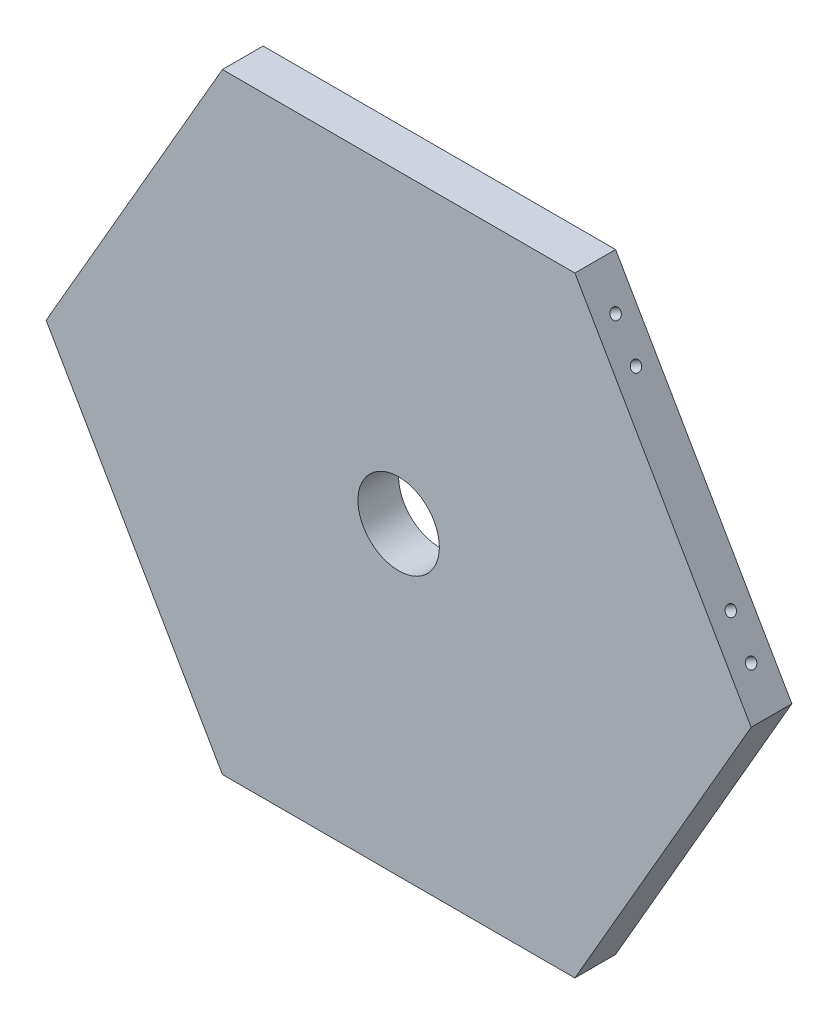
ISO-10303-21;
HEADER;
FILE_DESCRIPTION(('STEP AP214'),'2;1');
FILE_NAME('part.step','',(''),(''),'','','');
FILE_SCHEMA(('AUTOMOTIVE_DESIGN { 1 0 10303 214 1 1 1 1 }'));
ENDSEC;
DATA;
#1=APPLICATION_CONTEXT('core data for automotive mechanical design processes');
#2=APPLICATION_PROTOCOL_DEFINITION('international standard','automotive_design',2000,#1);
#3=PRODUCT_CONTEXT('',#1,'mechanical');
#4=PRODUCT('Part','Part','',(#3));
#5=PRODUCT_RELATED_PRODUCT_CATEGORY('part','',(#4));
#6=PRODUCT_DEFINITION_FORMATION('','',#4);
#7=PRODUCT_DEFINITION_CONTEXT('part definition',#1,'design');
#8=PRODUCT_DEFINITION('design','',#6,#7);
#9=PRODUCT_DEFINITION_SHAPE('','',#8);
#10=(LENGTH_UNIT() NAMED_UNIT(*) SI_UNIT(.MILLI.,.METRE.));
#11=(NAMED_UNIT(*) PLANE_ANGLE_UNIT() SI_UNIT($,.RADIAN.));
#12=(NAMED_UNIT(*) SI_UNIT($,.STERADIAN.) SOLID_ANGLE_UNIT());
#13=UNCERTAINTY_MEASURE_WITH_UNIT(LENGTH_MEASURE(1.E-05),#10,'distance_accuracy_value','');
#14=(GEOMETRIC_REPRESENTATION_CONTEXT(3) GLOBAL_UNCERTAINTY_ASSIGNED_CONTEXT((#13)) GLOBAL_UNIT_ASSIGNED_CONTEXT((#10,
#11,#12)) REPRESENTATION_CONTEXT('',''));
#15=CARTESIAN_POINT('',(0.,0.,0.));
#16=DIRECTION('',(0.,0.,1.));
#17=DIRECTION('',(1.,0.,0.));
#18=AXIS2_PLACEMENT_3D('',#15,#16,#17);
#19=CARTESIAN_POINT('',(-86.6025403784438,0.,5.));
#20=DIRECTION('',(0.866025403784439,0.5,0.));
#21=DIRECTION('',(-0.5,0.866025403784439,0.));
#22=AXIS2_PLACEMENT_3D('',#19,#20,#21);
#23=PLANE('',#22);
#24=DIRECTION('',(0.5,-0.866025403784439,0.));
#25=VECTOR('',#24,1.);
#26=CARTESIAN_POINT('',(-86.6025403784438,0.,-5.));
#27=LINE('',#26,#25);
#28=CARTESIAN_POINT('',(-86.6025403784438,0.,-5.));
#29=VERTEX_POINT('',#28);
#30=CARTESIAN_POINT('',(-43.3012701892219,-75.,-5.));
#31=VERTEX_POINT('',#30);
#32=EDGE_CURVE('E135',#29,#31,#27,.T.);
#33=ORIENTED_EDGE('',*,*,#32,.T.);
#34=DIRECTION('',(0.,0.,-1.));
#35=VECTOR('',#34,1.);
#36=CARTESIAN_POINT('',(-43.3012701892219,-75.,5.));
#37=LINE('',#36,#35);
#38=CARTESIAN_POINT('',(-43.3012701892219,-75.,5.));
#39=VERTEX_POINT('',#38);
#40=EDGE_CURVE('E11',#39,#31,#37,.T.);
#41=ORIENTED_EDGE('',*,*,#40,.F.);
#42=DIRECTION('',(0.5,-0.866025403784439,0.));
#43=VECTOR('',#42,1.);
#44=CARTESIAN_POINT('',(-86.6025403784438,0.,5.));
#45=LINE('',#44,#43);
#46=CARTESIAN_POINT('',(-86.6025403784438,0.,5.));
#47=VERTEX_POINT('',#46);
#48=EDGE_CURVE('E152',#47,#39,#45,.T.);
#49=ORIENTED_EDGE('',*,*,#48,.F.);
#50=DIRECTION('',(0.,0.,-1.));
#51=VECTOR('',#50,1.);
#52=CARTESIAN_POINT('',(-86.6025403784438,0.,5.));
#53=LINE('',#52,#51);
#54=EDGE_CURVE('E131',#47,#29,#53,.T.);
#55=ORIENTED_EDGE('',*,*,#54,.T.);
#56=EDGE_LOOP('',(#33,#41,#49,#55));
#57=FACE_BOUND('',#56,.T.);
#58=ADVANCED_FACE('F44',(#57),#23,.F.);
#59=CARTESIAN_POINT('',(-43.3012701892219,-75.,5.));
#60=DIRECTION('',(0.,1.,0.));
#61=DIRECTION('',(0.,0.,1.));
#62=AXIS2_PLACEMENT_3D('',#59,#60,#61);
#63=PLANE('',#62);
#64=CARTESIAN_POINT('',(-33.3012701892219,-75.,0.));
#65=DIRECTION('',(0.,-1.,0.));
#66=DIRECTION('',(0.,0.,-1.));
#67=AXIS2_PLACEMENT_3D('',#64,#65,#66);
#68=CIRCLE('',#67,1.25);
#69=CARTESIAN_POINT('',(-33.3012701892219,-75.,-1.25));
#70=VERTEX_POINT('',#69);
#71=EDGE_CURVE('E276',#70,#70,#68,.T.);
#72=ORIENTED_EDGE('',*,*,#71,.F.);
#73=EDGE_LOOP('',(#72));
#74=FACE_BOUND('',#73,.T.);
#75=CARTESIAN_POINT('',(-23.3012701892219,-75.,0.));
#76=DIRECTION('',(0.,-1.,0.));
#77=DIRECTION('',(0.,0.,-1.));
#78=AXIS2_PLACEMENT_3D('',#75,#76,#77);
#79=CIRCLE('',#78,1.25);
#80=CARTESIAN_POINT('',(-23.3012701892219,-75.,-1.25));
#81=VERTEX_POINT('',#80);
#82=EDGE_CURVE('E280',#81,#81,#79,.T.);
#83=ORIENTED_EDGE('',*,*,#82,.F.);
#84=EDGE_LOOP('',(#83));
#85=FACE_BOUND('',#84,.T.);
#86=CARTESIAN_POINT('',(23.3012701892219,-75.,0.));
#87=DIRECTION('',(0.,-1.,0.));
#88=DIRECTION('',(0.,0.,1.));
#89=AXIS2_PLACEMENT_3D('',#86,#87,#88);
#90=CIRCLE('',#89,1.25);
#91=CARTESIAN_POINT('',(23.3012701892219,-75.,1.25));
#92=VERTEX_POINT('',#91);
#93=EDGE_CURVE('E287',#92,#92,#90,.T.);
#94=ORIENTED_EDGE('',*,*,#93,.F.);
#95=EDGE_LOOP('',(#94));
#96=FACE_BOUND('',#95,.T.);
#97=CARTESIAN_POINT('',(33.3012701892219,-75.,0.));
#98=DIRECTION('',(0.,-1.,0.));
#99=DIRECTION('',(0.,0.,1.));
#100=AXIS2_PLACEMENT_3D('',#97,#98,#99);
#101=CIRCLE('',#100,1.25);
#102=CARTESIAN_POINT('',(33.3012701892219,-75.,1.25));
#103=VERTEX_POINT('',#102);
#104=EDGE_CURVE('E295',#103,#103,#101,.T.);
#105=ORIENTED_EDGE('',*,*,#104,.F.);
#106=EDGE_LOOP('',(#105));
#107=FACE_BOUND('',#106,.T.);
#108=DIRECTION('',(1.,0.,0.));
#109=VECTOR('',#108,1.);
#110=CARTESIAN_POINT('',(-43.3012701892219,-75.,-5.));
#111=LINE('',#110,#109);
#112=CARTESIAN_POINT('',(43.3012701892219,-75.,-5.));
#113=VERTEX_POINT('',#112);
#114=EDGE_CURVE('E139',#31,#113,#111,.T.);
#115=ORIENTED_EDGE('',*,*,#114,.T.);
#116=DIRECTION('',(0.,0.,-1.));
#117=VECTOR('',#116,1.);
#118=CARTESIAN_POINT('',(43.3012701892219,-75.,5.));
#119=LINE('',#118,#117);
#120=CARTESIAN_POINT('',(43.3012701892219,-75.,5.));
#121=VERTEX_POINT('',#120);
#122=EDGE_CURVE('E53',#121,#113,#119,.T.);
#123=ORIENTED_EDGE('',*,*,#122,.F.);
#124=DIRECTION('',(1.,0.,0.));
#125=VECTOR('',#124,1.);
#126=CARTESIAN_POINT('',(-43.3012701892219,-75.,5.));
#127=LINE('',#126,#125);
#128=EDGE_CURVE('E98',#39,#121,#127,.T.);
#129=ORIENTED_EDGE('',*,*,#128,.F.);
#130=ORIENTED_EDGE('',*,*,#40,.T.);
#131=EDGE_LOOP('',(#115,#123,#129,#130));
#132=FACE_BOUND('',#131,.T.);
#133=ADVANCED_FACE('F185',(#74,#85,#96,#107,#132),#63,.F.);
#134=CARTESIAN_POINT('',(43.3012701892219,-75.,5.));
#135=DIRECTION('',(-0.866025403784439,0.5,0.));
#136=DIRECTION('',(-0.5,-0.866025403784439,0.));
#137=AXIS2_PLACEMENT_3D('',#134,#135,#136);
#138=PLANE('',#137);
#139=DIRECTION('',(0.5,0.866025403784439,0.));
#140=VECTOR('',#139,1.);
#141=CARTESIAN_POINT('',(43.3012701892219,-75.,-5.));
#142=LINE('',#141,#140);
#143=CARTESIAN_POINT('',(86.6025403784438,0.,-5.));
#144=VERTEX_POINT('',#143);
#145=EDGE_CURVE('E143',#113,#144,#142,.T.);
#146=ORIENTED_EDGE('',*,*,#145,.T.);
#147=DIRECTION('',(0.,0.,-1.));
#148=VECTOR('',#147,1.);
#149=CARTESIAN_POINT('',(86.6025403784438,0.,5.));
#150=LINE('',#149,#148);
#151=CARTESIAN_POINT('',(86.6025403784438,0.,5.));
#152=VERTEX_POINT('',#151);
#153=EDGE_CURVE('E122',#152,#144,#150,.T.);
#154=ORIENTED_EDGE('',*,*,#153,.F.);
#155=DIRECTION('',(0.5,0.866025403784439,0.));
#156=VECTOR('',#155,1.);
#157=CARTESIAN_POINT('',(43.3012701892219,-75.,5.));
#158=LINE('',#157,#156);
#159=EDGE_CURVE('E111',#121,#152,#158,.T.);
#160=ORIENTED_EDGE('',*,*,#159,.F.);
#161=ORIENTED_EDGE('',*,*,#122,.T.);
#162=EDGE_LOOP('',(#146,#154,#160,#161));
#163=FACE_BOUND('',#162,.T.);
#164=ADVANCED_FACE('F163',(#163),#138,.F.);
#165=CARTESIAN_POINT('',(86.6025403784438,0.,5.));
#166=DIRECTION('',(-0.866025403784439,-0.5,0.));
#167=DIRECTION('',(0.5,-0.866025403784439,0.));
#168=AXIS2_PLACEMENT_3D('',#165,#166,#167);
#169=PLANE('',#168);
#170=CARTESIAN_POINT('',(81.6025403784439,8.66025403784365,0.));
#171=DIRECTION('',(0.866025403784443,0.499999999999992,0.));
#172=DIRECTION('',(0.,0.,-1.));
#173=AXIS2_PLACEMENT_3D('',#170,#171,#172);
#174=CIRCLE('',#173,1.25);
#175=CARTESIAN_POINT('',(81.6025403784439,8.66025403784365,-1.25));
#176=VERTEX_POINT('',#175);
#177=EDGE_CURVE('E204',#176,#176,#174,.T.);
#178=ORIENTED_EDGE('',*,*,#177,.F.);
#179=EDGE_LOOP('',(#178));
#180=FACE_BOUND('',#179,.T.);
#181=CARTESIAN_POINT('',(76.602540378444,17.3205080756881,0.));
#182=DIRECTION('',(0.866025403784443,0.499999999999992,0.));
#183=DIRECTION('',(0.,0.,-1.));
#184=AXIS2_PLACEMENT_3D('',#181,#182,#183);
#185=CIRCLE('',#184,1.25);
#186=CARTESIAN_POINT('',(76.602540378444,17.3205080756881,-1.25));
#187=VERTEX_POINT('',#186);
#188=EDGE_CURVE('E208',#187,#187,#185,.T.);
#189=ORIENTED_EDGE('',*,*,#188,.F.);
#190=EDGE_LOOP('',(#189));
#191=FACE_BOUND('',#190,.T.);
#192=CARTESIAN_POINT('',(53.3012701892225,57.6794919243107,0.));
#193=DIRECTION('',(0.866025403784443,0.499999999999992,0.));
#194=DIRECTION('',(0.,0.,1.));
#195=AXIS2_PLACEMENT_3D('',#192,#193,#194);
#196=CIRCLE('',#195,1.25);
#197=CARTESIAN_POINT('',(53.3012701892225,57.6794919243107,1.25));
#198=VERTEX_POINT('',#197);
#199=EDGE_CURVE('E212',#198,#198,#196,.T.);
#200=ORIENTED_EDGE('',*,*,#199,.F.);
#201=EDGE_LOOP('',(#200));
#202=FACE_BOUND('',#201,.T.);
#203=CARTESIAN_POINT('',(48.3012701892225,66.3397459621551,0.));
#204=DIRECTION('',(0.866025403784443,0.499999999999992,0.));
#205=DIRECTION('',(0.,0.,1.));
#206=AXIS2_PLACEMENT_3D('',#203,#204,#205);
#207=CIRCLE('',#206,1.25);
#208=CARTESIAN_POINT('',(48.3012701892225,66.3397459621551,1.25));
#209=VERTEX_POINT('',#208);
#210=EDGE_CURVE('E215',#209,#209,#207,.T.);
#211=ORIENTED_EDGE('',*,*,#210,.F.);
#212=EDGE_LOOP('',(#211));
#213=FACE_BOUND('',#212,.T.);
#214=DIRECTION('',(-0.5,0.866025403784439,0.));
#215=VECTOR('',#214,1.);
#216=CARTESIAN_POINT('',(86.6025403784438,0.,-5.));
#217=LINE('',#216,#215);
#218=CARTESIAN_POINT('',(43.3012701892219,75.,-5.));
#219=VERTEX_POINT('',#218);
#220=EDGE_CURVE('E120',#144,#219,#217,.T.);
#221=ORIENTED_EDGE('',*,*,#220,.T.);
#222=DIRECTION('',(0.,0.,-1.));
#223=VECTOR('',#222,1.);
#224=CARTESIAN_POINT('',(43.3012701892219,75.,5.));
#225=LINE('',#224,#223);
#226=CARTESIAN_POINT('',(43.3012701892219,75.,5.));
#227=VERTEX_POINT('',#226);
#228=EDGE_CURVE('E117',#227,#219,#225,.T.);
#229=ORIENTED_EDGE('',*,*,#228,.F.);
#230=DIRECTION('',(-0.5,0.866025403784439,0.));
#231=VECTOR('',#230,1.);
#232=CARTESIAN_POINT('',(86.6025403784438,0.,5.));
#233=LINE('',#232,#231);
#234=EDGE_CURVE('E105',#152,#227,#233,.T.);
#235=ORIENTED_EDGE('',*,*,#234,.F.);
#236=ORIENTED_EDGE('',*,*,#153,.T.);
#237=EDGE_LOOP('',(#221,#229,#235,#236));
#238=FACE_BOUND('',#237,.T.);
#239=ADVANCED_FACE('F118',(#180,#191,#202,#213,#238),#169,.F.);
#240=CARTESIAN_POINT('',(43.3012701892219,75.,5.));
#241=DIRECTION('',(0.,-1.,0.));
#242=DIRECTION('',(0.,0.,-1.));
#243=AXIS2_PLACEMENT_3D('',#240,#241,#242);
#244=PLANE('',#243);
#245=DIRECTION('',(-1.,0.,0.));
#246=VECTOR('',#245,1.);
#247=CARTESIAN_POINT('',(43.3012701892219,75.,-5.));
#248=LINE('',#247,#246);
#249=CARTESIAN_POINT('',(-43.3012701892219,75.,-5.));
#250=VERTEX_POINT('',#249);
#251=EDGE_CURVE('E84',#219,#250,#248,.T.);
#252=ORIENTED_EDGE('',*,*,#251,.T.);
#253=DIRECTION('',(0.,0.,-1.));
#254=VECTOR('',#253,1.);
#255=CARTESIAN_POINT('',(-43.3012701892219,75.,5.));
#256=LINE('',#255,#254);
#257=CARTESIAN_POINT('',(-43.3012701892219,75.,5.));
#258=VERTEX_POINT('',#257);
#259=EDGE_CURVE('E123',#258,#250,#256,.T.);
#260=ORIENTED_EDGE('',*,*,#259,.F.);
#261=DIRECTION('',(-1.,0.,0.));
#262=VECTOR('',#261,1.);
#263=CARTESIAN_POINT('',(43.3012701892219,75.,5.));
#264=LINE('',#263,#262);
#265=EDGE_CURVE('E109',#227,#258,#264,.T.);
#266=ORIENTED_EDGE('',*,*,#265,.F.);
#267=ORIENTED_EDGE('',*,*,#228,.T.);
#268=EDGE_LOOP('',(#252,#260,#266,#267));
#269=FACE_BOUND('',#268,.T.);
#270=ADVANCED_FACE('F125',(#269),#244,.F.);
#271=CARTESIAN_POINT('',(-43.3012701892219,75.,5.));
#272=DIRECTION('',(0.866025403784439,-0.5,0.));
#273=DIRECTION('',(0.5,0.866025403784439,0.));
#274=AXIS2_PLACEMENT_3D('',#271,#272,#273);
#275=PLANE('',#274);
#276=CARTESIAN_POINT('',(-53.3012701892217,57.6794919243114,0.));
#277=DIRECTION('',(-0.866025403784436,0.500000000000004,0.));
#278=DIRECTION('',(0.,0.,-1.));
#279=AXIS2_PLACEMENT_3D('',#276,#277,#278);
#280=CIRCLE('',#279,1.25);
#281=CARTESIAN_POINT('',(-53.3012701892217,57.6794919243114,-1.25));
#282=VERTEX_POINT('',#281);
#283=EDGE_CURVE('E231',#282,#282,#280,.T.);
#284=ORIENTED_EDGE('',*,*,#283,.F.);
#285=EDGE_LOOP('',(#284));
#286=FACE_BOUND('',#285,.T.);
#287=CARTESIAN_POINT('',(-76.6025403784438,17.3205080756891,0.));
#288=DIRECTION('',(-0.866025403784436,0.500000000000004,0.));
#289=DIRECTION('',(0.,0.,1.));
#290=AXIS2_PLACEMENT_3D('',#287,#288,#289);
#291=CIRCLE('',#290,1.25);
#292=CARTESIAN_POINT('',(-76.6025403784438,17.3205080756891,1.25));
#293=VERTEX_POINT('',#292);
#294=EDGE_CURVE('E239',#293,#293,#291,.T.);
#295=ORIENTED_EDGE('',*,*,#294,.F.);
#296=EDGE_LOOP('',(#295));
#297=FACE_BOUND('',#296,.T.);
#298=CARTESIAN_POINT('',(-81.6025403784438,8.66025403784478,0.));
#299=DIRECTION('',(-0.866025403784436,0.500000000000004,0.));
#300=DIRECTION('',(0.,0.,1.));
#301=AXIS2_PLACEMENT_3D('',#298,#299,#300);
#302=CIRCLE('',#301,1.25);
#303=CARTESIAN_POINT('',(-81.6025403784438,8.66025403784478,1.25));
#304=VERTEX_POINT('',#303);
#305=EDGE_CURVE('E246',#304,#304,#302,.T.);
#306=ORIENTED_EDGE('',*,*,#305,.F.);
#307=EDGE_LOOP('',(#306));
#308=FACE_BOUND('',#307,.T.);
#309=CARTESIAN_POINT('',(-48.3012701892216,66.3397459621558,0.));
#310=DIRECTION('',(-0.866025403784436,0.500000000000004,0.));
#311=DIRECTION('',(0.,0.,-1.));
#312=AXIS2_PLACEMENT_3D('',#309,#310,#311);
#313=CIRCLE('',#312,1.25);
#314=CARTESIAN_POINT('',(-48.3012701892216,66.3397459621558,-1.25));
#315=VERTEX_POINT('',#314);
#316=EDGE_CURVE('E230',#315,#315,#313,.T.);
#317=ORIENTED_EDGE('',*,*,#316,.F.);
#318=EDGE_LOOP('',(#317));
#319=FACE_BOUND('',#318,.T.);
#320=DIRECTION('',(-0.5,-0.866025403784439,0.));
#321=VECTOR('',#320,1.);
#322=CARTESIAN_POINT('',(-43.3012701892219,75.,-5.));
#323=LINE('',#322,#321);
#324=EDGE_CURVE('E90',#250,#29,#323,.T.);
#325=ORIENTED_EDGE('',*,*,#324,.T.);
#326=ORIENTED_EDGE('',*,*,#54,.F.);
#327=DIRECTION('',(-0.5,-0.866025403784439,0.));
#328=VECTOR('',#327,1.);
#329=CARTESIAN_POINT('',(-43.3012701892219,75.,5.));
#330=LINE('',#329,#328);
#331=EDGE_CURVE('E61',#258,#47,#330,.T.);
#332=ORIENTED_EDGE('',*,*,#331,.F.);
#333=ORIENTED_EDGE('',*,*,#259,.T.);
#334=EDGE_LOOP('',(#325,#326,#332,#333));
#335=FACE_BOUND('',#334,.T.);
#336=ADVANCED_FACE('F170',(#286,#297,#308,#319,#335),#275,.F.);
#337=CARTESIAN_POINT('',(0.,0.,5.));
#338=DIRECTION('',(0.,0.,1.));
#339=DIRECTION('',(1.,0.,0.));
#340=AXIS2_PLACEMENT_3D('',#337,#338,#339);
#341=PLANE('',#340);
#342=CARTESIAN_POINT('',(0.,0.,5.));
#343=DIRECTION('',(0.,0.,1.));
#344=DIRECTION('',(1.,0.,0.));
#345=AXIS2_PLACEMENT_3D('',#342,#343,#344);
#346=CIRCLE('',#345,10.);
#347=CARTESIAN_POINT('',(10.,0.,5.));
#348=VERTEX_POINT('',#347);
#349=EDGE_CURVE('E261',#348,#348,#346,.T.);
#350=ORIENTED_EDGE('',*,*,#349,.F.);
#351=EDGE_LOOP('',(#350));
#352=FACE_BOUND('',#351,.T.);
#353=ORIENTED_EDGE('',*,*,#48,.T.);
#354=ORIENTED_EDGE('',*,*,#128,.T.);
#355=ORIENTED_EDGE('',*,*,#159,.T.);
#356=ORIENTED_EDGE('',*,*,#234,.T.);
#357=ORIENTED_EDGE('',*,*,#265,.T.);
#358=ORIENTED_EDGE('',*,*,#331,.T.);
#359=EDGE_LOOP('',(#353,#354,#355,#356,#357,#358));
#360=FACE_BOUND('',#359,.T.);
#361=ADVANCED_FACE('F107',(#352,#360),#341,.T.);
#362=CARTESIAN_POINT('',(0.,0.,-5.));
#363=DIRECTION('',(0.,0.,1.));
#364=DIRECTION('',(1.,0.,0.));
#365=AXIS2_PLACEMENT_3D('',#362,#363,#364);
#366=PLANE('',#365);
#367=CARTESIAN_POINT('',(0.,0.,-5.));
#368=DIRECTION('',(0.,0.,1.));
#369=DIRECTION('',(1.,0.,0.));
#370=AXIS2_PLACEMENT_3D('',#367,#368,#369);
#371=CIRCLE('',#370,10.);
#372=CARTESIAN_POINT('',(10.,0.,-5.));
#373=VERTEX_POINT('',#372);
#374=EDGE_CURVE('E265',#373,#373,#371,.T.);
#375=ORIENTED_EDGE('',*,*,#374,.T.);
#376=EDGE_LOOP('',(#375));
#377=FACE_BOUND('',#376,.T.);
#378=ORIENTED_EDGE('',*,*,#32,.F.);
#379=ORIENTED_EDGE('',*,*,#324,.F.);
#380=ORIENTED_EDGE('',*,*,#251,.F.);
#381=ORIENTED_EDGE('',*,*,#220,.F.);
#382=ORIENTED_EDGE('',*,*,#145,.F.);
#383=ORIENTED_EDGE('',*,*,#114,.F.);
#384=EDGE_LOOP('',(#378,#379,#380,#381,#382,#383));
#385=FACE_BOUND('',#384,.T.);
#386=ADVANCED_FACE('F166',(#377,#385),#366,.F.);
#387=CARTESIAN_POINT('',(33.3012701892219,-65.,0.));
#388=DIRECTION('',(0.,-1.,0.));
#389=DIRECTION('',(0.,0.,-1.));
#390=AXIS2_PLACEMENT_3D('',#387,#388,#389);
#391=CYLINDRICAL_SURFACE('',#390,1.25);
#392=CARTESIAN_POINT('',(33.3012701892219,-65.,0.));
#393=DIRECTION('',(0.,-1.,0.));
#394=DIRECTION('',(0.,0.,1.));
#395=AXIS2_PLACEMENT_3D('',#392,#393,#394);
#396=CIRCLE('',#395,1.25);
#397=CARTESIAN_POINT('',(33.3012701892219,-65.,1.25));
#398=VERTEX_POINT('',#397);
#399=EDGE_CURVE('E269',#398,#398,#396,.T.);
#400=ORIENTED_EDGE('',*,*,#399,.F.);
#401=EDGE_LOOP('',(#400));
#402=FACE_BOUND('',#401,.T.);
#403=ORIENTED_EDGE('',*,*,#104,.T.);
#404=EDGE_LOOP('',(#403));
#405=FACE_BOUND('',#404,.T.);
#406=ADVANCED_FACE('F407',(#402,#405),#391,.F.);
#407=CARTESIAN_POINT('',(33.3012701892219,-65.,0.));
#408=DIRECTION('',(0.,1.,0.));
#409=DIRECTION('',(0.,0.,1.));
#410=AXIS2_PLACEMENT_3D('',#407,#408,#409);
#411=PLANE('',#410);
#412=ORIENTED_EDGE('',*,*,#399,.T.);
#413=EDGE_LOOP('',(#412));
#414=FACE_BOUND('',#413,.T.);
#415=ADVANCED_FACE('F402',(#414),#411,.F.);
#416=CARTESIAN_POINT('',(23.3012701892219,-65.,0.));
#417=DIRECTION('',(0.,-1.,0.));
#418=DIRECTION('',(0.,0.,-1.));
#419=AXIS2_PLACEMENT_3D('',#416,#417,#418);
#420=CYLINDRICAL_SURFACE('',#419,1.25);
#421=CARTESIAN_POINT('',(23.3012701892219,-65.,0.));
#422=DIRECTION('',(0.,-1.,0.));
#423=DIRECTION('',(0.,0.,1.));
#424=AXIS2_PLACEMENT_3D('',#421,#422,#423);
#425=CIRCLE('',#424,1.25);
#426=CARTESIAN_POINT('',(23.3012701892219,-65.,1.25));
#427=VERTEX_POINT('',#426);
#428=EDGE_CURVE('E291',#427,#427,#425,.T.);
#429=ORIENTED_EDGE('',*,*,#428,.F.);
#430=EDGE_LOOP('',(#429));
#431=FACE_BOUND('',#430,.T.);
#432=ORIENTED_EDGE('',*,*,#93,.T.);
#433=EDGE_LOOP('',(#432));
#434=FACE_BOUND('',#433,.T.);
#435=ADVANCED_FACE('F399',(#431,#434),#420,.F.);
#436=CARTESIAN_POINT('',(23.3012701892219,-65.,0.));
#437=DIRECTION('',(0.,1.,0.));
#438=DIRECTION('',(0.,0.,1.));
#439=AXIS2_PLACEMENT_3D('',#436,#437,#438);
#440=PLANE('',#439);
#441=ORIENTED_EDGE('',*,*,#428,.T.);
#442=EDGE_LOOP('',(#441));
#443=FACE_BOUND('',#442,.T.);
#444=ADVANCED_FACE('F394',(#443),#440,.F.);
#445=CARTESIAN_POINT('',(-23.3012701892219,-65.,0.));
#446=DIRECTION('',(0.,-1.,0.));
#447=DIRECTION('',(0.,0.,-1.));
#448=AXIS2_PLACEMENT_3D('',#445,#446,#447);
#449=CYLINDRICAL_SURFACE('',#448,1.25);
#450=CARTESIAN_POINT('',(-23.3012701892219,-65.,0.));
#451=DIRECTION('',(0.,-1.,0.));
#452=DIRECTION('',(0.,0.,-1.));
#453=AXIS2_PLACEMENT_3D('',#450,#451,#452);
#454=CIRCLE('',#453,1.25);
#455=CARTESIAN_POINT('',(-23.3012701892219,-65.,-1.25));
#456=VERTEX_POINT('',#455);
#457=EDGE_CURVE('E283',#456,#456,#454,.T.);
#458=ORIENTED_EDGE('',*,*,#457,.F.);
#459=EDGE_LOOP('',(#458));
#460=FACE_BOUND('',#459,.T.);
#461=ORIENTED_EDGE('',*,*,#82,.T.);
#462=EDGE_LOOP('',(#461));
#463=FACE_BOUND('',#462,.T.);
#464=ADVANCED_FACE('F391',(#460,#463),#449,.F.);
#465=CARTESIAN_POINT('',(-23.3012701892219,-65.,0.));
#466=DIRECTION('',(0.,-1.,0.));
#467=DIRECTION('',(0.,0.,-1.));
#468=AXIS2_PLACEMENT_3D('',#465,#466,#467);
#469=PLANE('',#468);
#470=ORIENTED_EDGE('',*,*,#457,.T.);
#471=EDGE_LOOP('',(#470));
#472=FACE_BOUND('',#471,.T.);
#473=ADVANCED_FACE('F389',(#472),#469,.T.);
#474=CARTESIAN_POINT('',(-33.3012701892219,-65.,0.));
#475=DIRECTION('',(0.,-1.,0.));
#476=DIRECTION('',(0.,0.,-1.));
#477=AXIS2_PLACEMENT_3D('',#474,#475,#476);
#478=CYLINDRICAL_SURFACE('',#477,1.25);
#479=CARTESIAN_POINT('',(-33.3012701892219,-65.,0.));
#480=DIRECTION('',(0.,-1.,0.));
#481=DIRECTION('',(0.,0.,-1.));
#482=AXIS2_PLACEMENT_3D('',#479,#480,#481);
#483=CIRCLE('',#482,1.25);
#484=CARTESIAN_POINT('',(-33.3012701892219,-65.,-1.25));
#485=VERTEX_POINT('',#484);
#486=EDGE_CURVE('E140',#485,#485,#483,.T.);
#487=ORIENTED_EDGE('',*,*,#486,.F.);
#488=EDGE_LOOP('',(#487));
#489=FACE_BOUND('',#488,.T.);
#490=ORIENTED_EDGE('',*,*,#71,.T.);
#491=EDGE_LOOP('',(#490));
#492=FACE_BOUND('',#491,.T.);
#493=ADVANCED_FACE('F385',(#489,#492),#478,.F.);
#494=CARTESIAN_POINT('',(-33.3012701892219,-65.,0.));
#495=DIRECTION('',(0.,-1.,0.));
#496=DIRECTION('',(0.,0.,-1.));
#497=AXIS2_PLACEMENT_3D('',#494,#495,#496);
#498=PLANE('',#497);
#499=ORIENTED_EDGE('',*,*,#486,.T.);
#500=EDGE_LOOP('',(#499));
#501=FACE_BOUND('',#500,.T.);
#502=ADVANCED_FACE('F381',(#501),#498,.T.);
#503=CARTESIAN_POINT('',(0.,0.,-5.));
#504=DIRECTION('',(0.,0.,1.));
#505=DIRECTION('',(1.,0.,0.));
#506=AXIS2_PLACEMENT_3D('',#503,#504,#505);
#507=CYLINDRICAL_SURFACE('',#506,10.);
#508=ORIENTED_EDGE('',*,*,#374,.F.);
#509=EDGE_LOOP('',(#508));
#510=FACE_BOUND('',#509,.T.);
#511=ORIENTED_EDGE('',*,*,#349,.T.);
#512=EDGE_LOOP('',(#511));
#513=FACE_BOUND('',#512,.T.);
#514=ADVANCED_FACE('F377',(#510,#513),#507,.F.);
#515=CARTESIAN_POINT('',(-39.6410161513773,61.3397459621558,0.));
#516=DIRECTION('',(-0.866025403784436,0.500000000000004,0.));
#517=DIRECTION('',(-0.500000000000004,-0.866025403784436,0.));
#518=AXIS2_PLACEMENT_3D('',#515,#516,#517);
#519=CYLINDRICAL_SURFACE('',#518,1.25);
#520=CARTESIAN_POINT('',(-39.6410161513773,61.3397459621558,0.));
#521=DIRECTION('',(-0.866025403784436,0.500000000000004,0.));
#522=DIRECTION('',(0.,0.,-1.));
#523=AXIS2_PLACEMENT_3D('',#520,#521,#522);
#524=CIRCLE('',#523,1.25);
#525=CARTESIAN_POINT('',(-39.6410161513773,61.3397459621558,-1.25));
#526=VERTEX_POINT('',#525);
#527=EDGE_CURVE('E257',#526,#526,#524,.T.);
#528=ORIENTED_EDGE('',*,*,#527,.F.);
#529=EDGE_LOOP('',(#528));
#530=FACE_BOUND('',#529,.T.);
#531=ORIENTED_EDGE('',*,*,#316,.T.);
#532=EDGE_LOOP('',(#531));
#533=FACE_BOUND('',#532,.T.);
#534=ADVANCED_FACE('F373',(#530,#533),#519,.F.);
#535=CARTESIAN_POINT('',(-39.6410161513773,61.3397459621558,0.));
#536=DIRECTION('',(-0.866025403784436,0.500000000000004,0.));
#537=DIRECTION('',(0.,0.,-1.));
#538=AXIS2_PLACEMENT_3D('',#535,#536,#537);
#539=PLANE('',#538);
#540=ORIENTED_EDGE('',*,*,#527,.T.);
#541=EDGE_LOOP('',(#540));
#542=FACE_BOUND('',#541,.T.);
#543=ADVANCED_FACE('F360',(#542),#539,.T.);
#544=CARTESIAN_POINT('',(-72.9422863405995,3.66025403784474,0.));
#545=DIRECTION('',(-0.866025403784436,0.500000000000004,0.));
#546=DIRECTION('',(-0.500000000000004,-0.866025403784436,0.));
#547=AXIS2_PLACEMENT_3D('',#544,#545,#546);
#548=CYLINDRICAL_SURFACE('',#547,1.25);
#549=CARTESIAN_POINT('',(-72.9422863405995,3.66025403784474,0.));
#550=DIRECTION('',(-0.866025403784436,0.500000000000004,0.));
#551=DIRECTION('',(0.,0.,1.));
#552=AXIS2_PLACEMENT_3D('',#549,#550,#551);
#553=CIRCLE('',#552,1.25);
#554=CARTESIAN_POINT('',(-72.9422863405995,3.66025403784474,1.25));
#555=VERTEX_POINT('',#554);
#556=EDGE_CURVE('E242',#555,#555,#553,.T.);
#557=ORIENTED_EDGE('',*,*,#556,.F.);
#558=EDGE_LOOP('',(#557));
#559=FACE_BOUND('',#558,.T.);
#560=ORIENTED_EDGE('',*,*,#305,.T.);
#561=EDGE_LOOP('',(#560));
#562=FACE_BOUND('',#561,.T.);
#563=ADVANCED_FACE('F356',(#559,#562),#548,.F.);
#564=CARTESIAN_POINT('',(-72.9422863405995,3.66025403784474,0.));
#565=DIRECTION('',(0.866025403784436,-0.500000000000004,0.));
#566=DIRECTION('',(0.,0.,1.));
#567=AXIS2_PLACEMENT_3D('',#564,#565,#566);
#568=PLANE('',#567);
#569=ORIENTED_EDGE('',*,*,#556,.T.);
#570=EDGE_LOOP('',(#569));
#571=FACE_BOUND('',#570,.T.);
#572=ADVANCED_FACE('F352',(#571),#568,.F.);
#573=CARTESIAN_POINT('',(-67.9422863405994,12.3205080756891,0.));
#574=DIRECTION('',(-0.866025403784436,0.500000000000004,0.));
#575=DIRECTION('',(-0.500000000000004,-0.866025403784436,0.));
#576=AXIS2_PLACEMENT_3D('',#573,#574,#575);
#577=CYLINDRICAL_SURFACE('',#576,1.25);
#578=CARTESIAN_POINT('',(-67.9422863405994,12.3205080756891,0.));
#579=DIRECTION('',(-0.866025403784436,0.500000000000004,0.));
#580=DIRECTION('',(0.,0.,1.));
#581=AXIS2_PLACEMENT_3D('',#578,#579,#580);
#582=CIRCLE('',#581,1.25);
#583=CARTESIAN_POINT('',(-67.9422863405994,12.3205080756891,1.25));
#584=VERTEX_POINT('',#583);
#585=EDGE_CURVE('E235',#584,#584,#582,.T.);
#586=ORIENTED_EDGE('',*,*,#585,.F.);
#587=EDGE_LOOP('',(#586));
#588=FACE_BOUND('',#587,.T.);
#589=ORIENTED_EDGE('',*,*,#294,.T.);
#590=EDGE_LOOP('',(#589));
#591=FACE_BOUND('',#590,.T.);
#592=ADVANCED_FACE('F348',(#588,#591),#577,.F.);
#593=CARTESIAN_POINT('',(-67.9422863405994,12.3205080756891,0.));
#594=DIRECTION('',(0.866025403784436,-0.500000000000004,0.));
#595=DIRECTION('',(0.,0.,1.));
#596=AXIS2_PLACEMENT_3D('',#593,#594,#595);
#597=PLANE('',#596);
#598=ORIENTED_EDGE('',*,*,#585,.T.);
#599=EDGE_LOOP('',(#598));
#600=FACE_BOUND('',#599,.T.);
#601=ADVANCED_FACE('F344',(#600),#597,.F.);
#602=CARTESIAN_POINT('',(-44.6410161513773,52.6794919243114,0.));
#603=DIRECTION('',(-0.866025403784436,0.500000000000004,0.));
#604=DIRECTION('',(-0.500000000000004,-0.866025403784436,0.));
#605=AXIS2_PLACEMENT_3D('',#602,#603,#604);
#606=CYLINDRICAL_SURFACE('',#605,1.25);
#607=CARTESIAN_POINT('',(-44.6410161513773,52.6794919243114,0.));
#608=DIRECTION('',(-0.866025403784436,0.500000000000004,0.));
#609=DIRECTION('',(0.,0.,-1.));
#610=AXIS2_PLACEMENT_3D('',#607,#608,#609);
#611=CIRCLE('',#610,1.25);
#612=CARTESIAN_POINT('',(-44.6410161513773,52.6794919243114,-1.25));
#613=VERTEX_POINT('',#612);
#614=EDGE_CURVE('E226',#613,#613,#611,.T.);
#615=ORIENTED_EDGE('',*,*,#614,.F.);
#616=EDGE_LOOP('',(#615));
#617=FACE_BOUND('',#616,.T.);
#618=ORIENTED_EDGE('',*,*,#283,.T.);
#619=EDGE_LOOP('',(#618));
#620=FACE_BOUND('',#619,.T.);
#621=ADVANCED_FACE('F340',(#617,#620),#606,.F.);
#622=CARTESIAN_POINT('',(-44.6410161513773,52.6794919243114,0.));
#623=DIRECTION('',(-0.866025403784436,0.500000000000004,0.));
#624=DIRECTION('',(0.,0.,-1.));
#625=AXIS2_PLACEMENT_3D('',#622,#623,#624);
#626=PLANE('',#625);
#627=ORIENTED_EDGE('',*,*,#614,.T.);
#628=EDGE_LOOP('',(#627));
#629=FACE_BOUND('',#628,.T.);
#630=ADVANCED_FACE('F336',(#629),#626,.T.);
#631=CARTESIAN_POINT('',(39.6410161513781,61.3397459621552,0.));
#632=DIRECTION('',(0.866025403784443,0.499999999999992,0.));
#633=DIRECTION('',(-0.499999999999992,0.866025403784443,0.));
#634=AXIS2_PLACEMENT_3D('',#631,#632,#633);
#635=CYLINDRICAL_SURFACE('',#634,1.25);
#636=CARTESIAN_POINT('',(39.6410161513781,61.3397459621552,0.));
#637=DIRECTION('',(0.866025403784443,0.499999999999992,0.));
#638=DIRECTION('',(0.,0.,1.));
#639=AXIS2_PLACEMENT_3D('',#636,#637,#638);
#640=CIRCLE('',#639,1.25);
#641=CARTESIAN_POINT('',(39.6410161513781,61.3397459621552,1.25));
#642=VERTEX_POINT('',#641);
#643=EDGE_CURVE('E218',#642,#642,#640,.T.);
#644=ORIENTED_EDGE('',*,*,#643,.F.);
#645=EDGE_LOOP('',(#644));
#646=FACE_BOUND('',#645,.T.);
#647=ORIENTED_EDGE('',*,*,#210,.T.);
#648=EDGE_LOOP('',(#647));
#649=FACE_BOUND('',#648,.T.);
#650=ADVANCED_FACE('F329',(#646,#649),#635,.F.);
#651=CARTESIAN_POINT('',(39.6410161513781,61.3397459621552,0.));
#652=DIRECTION('',(-0.866025403784443,-0.499999999999992,0.));
#653=DIRECTION('',(0.,0.,1.));
#654=AXIS2_PLACEMENT_3D('',#651,#652,#653);
#655=PLANE('',#654);
#656=ORIENTED_EDGE('',*,*,#643,.T.);
#657=EDGE_LOOP('',(#656));
#658=FACE_BOUND('',#657,.T.);
#659=ADVANCED_FACE('F321',(#658),#655,.F.);
#660=CARTESIAN_POINT('',(44.641016151378,52.6794919243108,0.));
#661=DIRECTION('',(0.866025403784443,0.499999999999992,0.));
#662=DIRECTION('',(-0.499999999999992,0.866025403784443,0.));
#663=AXIS2_PLACEMENT_3D('',#660,#661,#662);
#664=CYLINDRICAL_SURFACE('',#663,1.25);
#665=CARTESIAN_POINT('',(44.641016151378,52.6794919243108,0.));
#666=DIRECTION('',(0.866025403784443,0.499999999999992,0.));
#667=DIRECTION('',(0.,0.,1.));
#668=AXIS2_PLACEMENT_3D('',#665,#666,#667);
#669=CIRCLE('',#668,1.25);
#670=CARTESIAN_POINT('',(44.641016151378,52.6794919243108,1.25));
#671=VERTEX_POINT('',#670);
#672=EDGE_CURVE('E309',#671,#671,#669,.T.);
#673=ORIENTED_EDGE('',*,*,#672,.F.);
#674=EDGE_LOOP('',(#673));
#675=FACE_BOUND('',#674,.T.);
#676=ORIENTED_EDGE('',*,*,#199,.T.);
#677=EDGE_LOOP('',(#676));
#678=FACE_BOUND('',#677,.T.);
#679=ADVANCED_FACE('F319',(#675,#678),#664,.F.);
#680=CARTESIAN_POINT('',(44.641016151378,52.6794919243108,0.));
#681=DIRECTION('',(-0.866025403784443,-0.499999999999992,0.));
#682=DIRECTION('',(0.,0.,1.));
#683=AXIS2_PLACEMENT_3D('',#680,#681,#682);
#684=PLANE('',#683);
#685=ORIENTED_EDGE('',*,*,#672,.T.);
#686=EDGE_LOOP('',(#685));
#687=FACE_BOUND('',#686,.T.);
#688=ADVANCED_FACE('F317',(#687),#684,.F.);
#689=CARTESIAN_POINT('',(67.9422863405996,12.3205080756882,0.));
#690=DIRECTION('',(0.866025403784443,0.499999999999992,0.));
#691=DIRECTION('',(-0.499999999999992,0.866025403784443,0.));
#692=AXIS2_PLACEMENT_3D('',#689,#690,#691);
#693=CYLINDRICAL_SURFACE('',#692,1.25);
#694=CARTESIAN_POINT('',(67.9422863405996,12.3205080756882,0.));
#695=DIRECTION('',(0.866025403784443,0.499999999999992,0.));
#696=DIRECTION('',(0.,0.,-1.));
#697=AXIS2_PLACEMENT_3D('',#694,#695,#696);
#698=CIRCLE('',#697,1.25);
#699=CARTESIAN_POINT('',(67.9422863405996,12.3205080756882,-1.25));
#700=VERTEX_POINT('',#699);
#701=EDGE_CURVE('E256',#700,#700,#698,.T.);
#702=ORIENTED_EDGE('',*,*,#701,.F.);
#703=EDGE_LOOP('',(#702));
#704=FACE_BOUND('',#703,.T.);
#705=ORIENTED_EDGE('',*,*,#188,.T.);
#706=EDGE_LOOP('',(#705));
#707=FACE_BOUND('',#706,.T.);
#708=ADVANCED_FACE('F327',(#704,#707),#693,.F.);
#709=CARTESIAN_POINT('',(67.9422863405996,12.3205080756882,0.));
#710=DIRECTION('',(0.866025403784443,0.499999999999992,0.));
#711=DIRECTION('',(0.,0.,-1.));
#712=AXIS2_PLACEMENT_3D('',#709,#710,#711);
#713=PLANE('',#712);
#714=ORIENTED_EDGE('',*,*,#701,.T.);
#715=EDGE_LOOP('',(#714));
#716=FACE_BOUND('',#715,.T.);
#717=ADVANCED_FACE('F369',(#716),#713,.T.);
#718=CARTESIAN_POINT('',(72.9422863405995,3.66025403784373,0.));
#719=DIRECTION('',(0.866025403784443,0.499999999999992,0.));
#720=DIRECTION('',(-0.499999999999992,0.866025403784443,0.));
#721=AXIS2_PLACEMENT_3D('',#718,#719,#720);
#722=CYLINDRICAL_SURFACE('',#721,1.25);
#723=CARTESIAN_POINT('',(72.9422863405995,3.66025403784373,0.));
#724=DIRECTION('',(0.866025403784443,0.499999999999992,0.));
#725=DIRECTION('',(0.,0.,-1.));
#726=AXIS2_PLACEMENT_3D('',#723,#724,#725);
#727=CIRCLE('',#726,1.25);
#728=CARTESIAN_POINT('',(72.9422863405995,3.66025403784373,-1.25));
#729=VERTEX_POINT('',#728);
#730=EDGE_CURVE('E250',#729,#729,#727,.T.);
#731=ORIENTED_EDGE('',*,*,#730,.F.);
#732=EDGE_LOOP('',(#731));
#733=FACE_BOUND('',#732,.T.);
#734=ORIENTED_EDGE('',*,*,#177,.T.);
#735=EDGE_LOOP('',(#734));
#736=FACE_BOUND('',#735,.T.);
#737=ADVANCED_FACE('F365',(#733,#736),#722,.F.);
#738=CARTESIAN_POINT('',(72.9422863405995,3.66025403784373,0.));
#739=DIRECTION('',(0.866025403784443,0.499999999999992,0.));
#740=DIRECTION('',(0.,0.,-1.));
#741=AXIS2_PLACEMENT_3D('',#738,#739,#740);
#742=PLANE('',#741);
#743=ORIENTED_EDGE('',*,*,#730,.T.);
#744=EDGE_LOOP('',(#743));
#745=FACE_BOUND('',#744,.T.);
#746=ADVANCED_FACE('F362',(#745),#742,.T.);
#747=CLOSED_SHELL('',(#58,#133,#164,#239,#270,#336,#361,#386,#406,#415,#435,#444,#464,#473,#493,
#502,#514,#534,#543,#563,#572,#592,#601,#621,#630,#650,#659,#679,#688,#708,#717,#737,#746));
#748=MANIFOLD_SOLID_BREP('B2',#747);
#749=ADVANCED_BREP_SHAPE_REPRESENTATION('',(#18,#748),#14);
#750=SHAPE_DEFINITION_REPRESENTATION(#9,#749);
ENDSEC;
END-ISO-10303-21;
